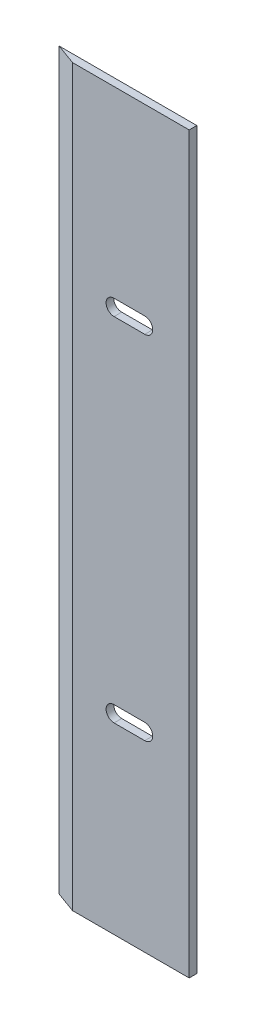
ISO-10303-21;
HEADER;
FILE_DESCRIPTION(('STEP AP214'),'2;1');
FILE_NAME('part.step','',(''),(''),'','','');
FILE_SCHEMA(('AUTOMOTIVE_DESIGN { 1 0 10303 214 1 1 1 1 }'));
ENDSEC;
DATA;
#1=APPLICATION_CONTEXT('core data for automotive mechanical design processes');
#2=APPLICATION_PROTOCOL_DEFINITION('international standard','automotive_design',2000,#1);
#3=PRODUCT_CONTEXT('',#1,'mechanical');
#4=PRODUCT('Part','Part','',(#3));
#5=PRODUCT_RELATED_PRODUCT_CATEGORY('part','',(#4));
#6=PRODUCT_DEFINITION_FORMATION('','',#4);
#7=PRODUCT_DEFINITION_CONTEXT('part definition',#1,'design');
#8=PRODUCT_DEFINITION('design','',#6,#7);
#9=PRODUCT_DEFINITION_SHAPE('','',#8);
#10=(LENGTH_UNIT() NAMED_UNIT(*) SI_UNIT(.MILLI.,.METRE.));
#11=(NAMED_UNIT(*) PLANE_ANGLE_UNIT() SI_UNIT($,.RADIAN.));
#12=(NAMED_UNIT(*) SI_UNIT($,.STERADIAN.) SOLID_ANGLE_UNIT());
#13=UNCERTAINTY_MEASURE_WITH_UNIT(LENGTH_MEASURE(1.E-05),#10,'distance_accuracy_value','');
#14=(GEOMETRIC_REPRESENTATION_CONTEXT(3) GLOBAL_UNCERTAINTY_ASSIGNED_CONTEXT((#13)) GLOBAL_UNIT_ASSIGNED_CONTEXT((#10,
#11,#12)) REPRESENTATION_CONTEXT('',''));
#15=CARTESIAN_POINT('',(0.,0.,0.));
#16=DIRECTION('',(0.,0.,1.));
#17=DIRECTION('',(1.,0.,0.));
#18=AXIS2_PLACEMENT_3D('',#15,#16,#17);
#19=CARTESIAN_POINT('',(0.,-24.0371227709754,1.));
#20=DIRECTION('',(0.,-1.,0.));
#21=DIRECTION('',(0.,0.,-1.));
#22=AXIS2_PLACEMENT_3D('',#19,#20,#21);
#23=PLANE('',#22);
#24=DIRECTION('',(-1.,0.,0.));
#25=VECTOR('',#24,1.);
#26=CARTESIAN_POINT('',(0.,-24.0371227709754,0.));
#27=LINE('',#26,#25);
#28=CARTESIAN_POINT('',(-54.2544310190482,-24.0371227709754,0.));
#29=VERTEX_POINT('',#28);
#30=CARTESIAN_POINT('',(-58.2719722755347,-24.0371227709754,0.));
#31=VERTEX_POINT('',#30);
#32=EDGE_CURVE('E172',#29,#31,#27,.T.);
#33=ORIENTED_EDGE('',*,*,#32,.T.);
#34=DIRECTION('',(0.,0.,-1.));
#35=VECTOR('',#34,1.);
#36=CARTESIAN_POINT('',(-58.2719722755347,-24.0371227709754,1.));
#37=LINE('',#36,#35);
#38=CARTESIAN_POINT('',(-58.2719722755347,-24.0371227709754,1.));
#39=VERTEX_POINT('',#38);
#40=EDGE_CURVE('E11',#39,#31,#37,.T.);
#41=ORIENTED_EDGE('',*,*,#40,.F.);
#42=DIRECTION('',(-1.,0.,0.));
#43=VECTOR('',#42,1.);
#44=CARTESIAN_POINT('',(0.,-24.0371227709754,1.));
#45=LINE('',#44,#43);
#46=CARTESIAN_POINT('',(-54.2544310190482,-24.0371227709754,1.));
#47=VERTEX_POINT('',#46);
#48=EDGE_CURVE('E130',#47,#39,#45,.T.);
#49=ORIENTED_EDGE('',*,*,#48,.F.);
#50=DIRECTION('',(0.,0.,-1.));
#51=VECTOR('',#50,1.);
#52=CARTESIAN_POINT('',(-54.2544310190482,-24.0371227709754,1.));
#53=LINE('',#52,#51);
#54=EDGE_CURVE('E180',#47,#29,#53,.T.);
#55=ORIENTED_EDGE('',*,*,#54,.T.);
#56=EDGE_LOOP('',(#33,#41,#49,#55));
#57=FACE_BOUND('',#56,.T.);
#58=ADVANCED_FACE('F34',(#57),#23,.F.);
#59=CARTESIAN_POINT('',(-58.2719722755347,-22.9999999999996,1.));
#60=DIRECTION('',(0.,0.,-1.));
#61=DIRECTION('',(-1.,0.,0.));
#62=AXIS2_PLACEMENT_3D('',#59,#60,#61);
#63=CYLINDRICAL_SURFACE('',#62,1.03712277097589);
#64=CARTESIAN_POINT('',(-58.2719722755347,-22.9999999999996,0.));
#65=DIRECTION('',(0.,0.,1.));
#66=DIRECTION('',(1.,0.,0.));
#67=AXIS2_PLACEMENT_3D('',#64,#65,#66);
#68=CIRCLE('',#67,1.03712277097589);
#69=CARTESIAN_POINT('',(-58.2719722755347,-21.9628772290237,0.));
#70=VERTEX_POINT('',#69);
#71=EDGE_CURVE('E136',#31,#70,#68,.F.);
#72=ORIENTED_EDGE('',*,*,#71,.T.);
#73=DIRECTION('',(0.,0.,-1.));
#74=VECTOR('',#73,1.);
#75=CARTESIAN_POINT('',(-58.2719722755347,-21.9628772290237,1.));
#76=LINE('',#75,#74);
#77=CARTESIAN_POINT('',(-58.2719722755347,-21.9628772290237,1.));
#78=VERTEX_POINT('',#77);
#79=EDGE_CURVE('E44',#78,#70,#76,.T.);
#80=ORIENTED_EDGE('',*,*,#79,.F.);
#81=CARTESIAN_POINT('',(-58.2719722755347,-22.9999999999996,1.));
#82=DIRECTION('',(0.,0.,1.));
#83=DIRECTION('',(1.,0.,0.));
#84=AXIS2_PLACEMENT_3D('',#81,#82,#83);
#85=CIRCLE('',#84,1.03712277097589);
#86=EDGE_CURVE('E124',#39,#78,#85,.F.);
#87=ORIENTED_EDGE('',*,*,#86,.F.);
#88=ORIENTED_EDGE('',*,*,#40,.T.);
#89=EDGE_LOOP('',(#72,#80,#87,#88));
#90=FACE_BOUND('',#89,.T.);
#91=ADVANCED_FACE('F135',(#90),#63,.F.);
#92=CARTESIAN_POINT('',(0.,-21.9628772290237,1.));
#93=DIRECTION('',(0.,-1.,0.));
#94=DIRECTION('',(0.,0.,-1.));
#95=AXIS2_PLACEMENT_3D('',#92,#93,#94);
#96=PLANE('',#95);
#97=DIRECTION('',(-1.,0.,0.));
#98=VECTOR('',#97,1.);
#99=CARTESIAN_POINT('',(0.,-21.9628772290237,0.));
#100=LINE('',#99,#98);
#101=CARTESIAN_POINT('',(-54.2544310190482,-21.9628772290237,0.));
#102=VERTEX_POINT('',#101);
#103=EDGE_CURVE('E176',#102,#70,#100,.T.);
#104=ORIENTED_EDGE('',*,*,#103,.F.);
#105=DIRECTION('',(0.,0.,-1.));
#106=VECTOR('',#105,1.);
#107=CARTESIAN_POINT('',(-54.2544310190482,-21.9628772290237,1.));
#108=LINE('',#107,#106);
#109=CARTESIAN_POINT('',(-54.2544310190482,-21.9628772290237,1.));
#110=VERTEX_POINT('',#109);
#111=EDGE_CURVE('E91',#110,#102,#108,.T.);
#112=ORIENTED_EDGE('',*,*,#111,.F.);
#113=DIRECTION('',(-1.,0.,0.));
#114=VECTOR('',#113,1.);
#115=CARTESIAN_POINT('',(0.,-21.9628772290237,1.));
#116=LINE('',#115,#114);
#117=EDGE_CURVE('E128',#110,#78,#116,.T.);
#118=ORIENTED_EDGE('',*,*,#117,.T.);
#119=ORIENTED_EDGE('',*,*,#79,.T.);
#120=EDGE_LOOP('',(#104,#112,#118,#119));
#121=FACE_BOUND('',#120,.T.);
#122=ADVANCED_FACE('F141',(#121),#96,.T.);
#123=CARTESIAN_POINT('',(0.,48.,1.));
#124=DIRECTION('',(0.,-1.,0.));
#125=DIRECTION('',(0.,0.,-1.));
#126=AXIS2_PLACEMENT_3D('',#123,#124,#125);
#127=PLANE('',#126);
#128=DIRECTION('',(-1.,0.,0.));
#129=VECTOR('',#128,1.);
#130=CARTESIAN_POINT('',(0.,48.,0.));
#131=LINE('',#130,#129);
#132=CARTESIAN_POINT('',(-48.4463024388675,48.,0.));
#133=VERTEX_POINT('',#132);
#134=CARTESIAN_POINT('',(-66.4463024388675,48.,0.));
#135=VERTEX_POINT('',#134);
#136=EDGE_CURVE('E160',#133,#135,#131,.T.);
#137=ORIENTED_EDGE('',*,*,#136,.T.);
#138=DIRECTION('',(-0.93969262078591,0.,-0.342020143325663));
#139=VECTOR('',#138,1.);
#140=CARTESIAN_POINT('',(-66.4463024388675,48.,0.));
#141=LINE('',#140,#139);
#142=CARTESIAN_POINT('',(-63.6988250194129,48.,1.));
#143=VERTEX_POINT('',#142);
#144=EDGE_CURVE('E245',#143,#135,#141,.T.);
#145=ORIENTED_EDGE('',*,*,#144,.F.);
#146=DIRECTION('',(-1.,0.,0.));
#147=VECTOR('',#146,1.);
#148=CARTESIAN_POINT('',(0.,48.,1.));
#149=LINE('',#148,#147);
#150=CARTESIAN_POINT('',(-48.4463024388675,48.,1.));
#151=VERTEX_POINT('',#150);
#152=EDGE_CURVE('E212',#151,#143,#149,.T.);
#153=ORIENTED_EDGE('',*,*,#152,.F.);
#154=DIRECTION('',(0.,0.,-1.));
#155=VECTOR('',#154,1.);
#156=CARTESIAN_POINT('',(-48.4463024388675,48.,1.));
#157=LINE('',#156,#155);
#158=EDGE_CURVE('E184',#151,#133,#157,.T.);
#159=ORIENTED_EDGE('',*,*,#158,.T.);
#160=EDGE_LOOP('',(#137,#145,#153,#159));
#161=FACE_BOUND('',#160,.T.);
#162=ADVANCED_FACE('F249',(#161),#127,.F.);
#163=CARTESIAN_POINT('',(0.,-48.,1.));
#164=DIRECTION('',(0.,-1.,0.));
#165=DIRECTION('',(0.,0.,-1.));
#166=AXIS2_PLACEMENT_3D('',#163,#164,#165);
#167=PLANE('',#166);
#168=DIRECTION('',(-0.93969262078591,0.,-0.342020143325663));
#169=VECTOR('',#168,1.);
#170=CARTESIAN_POINT('',(-66.4463024388675,-48.,0.));
#171=LINE('',#170,#169);
#172=CARTESIAN_POINT('',(-63.6988250194129,-48.,1.));
#173=VERTEX_POINT('',#172);
#174=CARTESIAN_POINT('',(-66.4463024388675,-48.,0.));
#175=VERTEX_POINT('',#174);
#176=EDGE_CURVE('E240',#173,#175,#171,.T.);
#177=ORIENTED_EDGE('',*,*,#176,.T.);
#178=DIRECTION('',(-1.,0.,0.));
#179=VECTOR('',#178,1.);
#180=CARTESIAN_POINT('',(0.,-48.,0.));
#181=LINE('',#180,#179);
#182=CARTESIAN_POINT('',(-48.4463024388675,-48.,0.));
#183=VERTEX_POINT('',#182);
#184=EDGE_CURVE('E166',#183,#175,#181,.T.);
#185=ORIENTED_EDGE('',*,*,#184,.F.);
#186=DIRECTION('',(0.,0.,-1.));
#187=VECTOR('',#186,1.);
#188=CARTESIAN_POINT('',(-48.4463024388675,-48.,1.));
#189=LINE('',#188,#187);
#190=CARTESIAN_POINT('',(-48.4463024388675,-48.,1.));
#191=VERTEX_POINT('',#190);
#192=EDGE_CURVE('E182',#191,#183,#189,.T.);
#193=ORIENTED_EDGE('',*,*,#192,.F.);
#194=DIRECTION('',(-1.,0.,0.));
#195=VECTOR('',#194,1.);
#196=CARTESIAN_POINT('',(0.,-48.,1.));
#197=LINE('',#196,#195);
#198=EDGE_CURVE('E220',#191,#173,#197,.T.);
#199=ORIENTED_EDGE('',*,*,#198,.T.);
#200=EDGE_LOOP('',(#177,#185,#193,#199));
#201=FACE_BOUND('',#200,.T.);
#202=ADVANCED_FACE('F238',(#201),#167,.T.);
#203=CARTESIAN_POINT('',(-58.2719722755347,22.9999999999996,1.));
#204=DIRECTION('',(0.,0.,-1.));
#205=DIRECTION('',(-1.,0.,0.));
#206=AXIS2_PLACEMENT_3D('',#203,#204,#205);
#207=CYLINDRICAL_SURFACE('',#206,1.03712277097589);
#208=CARTESIAN_POINT('',(-58.2719722755347,22.9999999999996,0.));
#209=DIRECTION('',(0.,0.,1.));
#210=DIRECTION('',(1.,0.,0.));
#211=AXIS2_PLACEMENT_3D('',#208,#209,#210);
#212=CIRCLE('',#211,1.03712277097589);
#213=CARTESIAN_POINT('',(-58.2719722755347,24.0371227709754,0.));
#214=VERTEX_POINT('',#213);
#215=CARTESIAN_POINT('',(-58.2719722755347,21.9628772290237,0.));
#216=VERTEX_POINT('',#215);
#217=EDGE_CURVE('E147',#214,#216,#212,.T.);
#218=ORIENTED_EDGE('',*,*,#217,.F.);
#219=DIRECTION('',(0.,0.,-1.));
#220=VECTOR('',#219,1.);
#221=CARTESIAN_POINT('',(-58.2719722755347,24.0371227709754,1.));
#222=LINE('',#221,#220);
#223=CARTESIAN_POINT('',(-58.2719722755347,24.0371227709754,1.));
#224=VERTEX_POINT('',#223);
#225=EDGE_CURVE('E38',#224,#214,#222,.T.);
#226=ORIENTED_EDGE('',*,*,#225,.F.);
#227=CARTESIAN_POINT('',(-58.2719722755347,22.9999999999996,1.));
#228=DIRECTION('',(0.,0.,1.));
#229=DIRECTION('',(1.,0.,0.));
#230=AXIS2_PLACEMENT_3D('',#227,#228,#229);
#231=CIRCLE('',#230,1.03712277097589);
#232=CARTESIAN_POINT('',(-58.2719722755347,21.9628772290237,1.));
#233=VERTEX_POINT('',#232);
#234=EDGE_CURVE('E179',#224,#233,#231,.T.);
#235=ORIENTED_EDGE('',*,*,#234,.T.);
#236=DIRECTION('',(0.,0.,-1.));
#237=VECTOR('',#236,1.);
#238=CARTESIAN_POINT('',(-58.2719722755347,21.9628772290237,1.));
#239=LINE('',#238,#237);
#240=EDGE_CURVE('E143',#233,#216,#239,.T.);
#241=ORIENTED_EDGE('',*,*,#240,.T.);
#242=EDGE_LOOP('',(#218,#226,#235,#241));
#243=FACE_BOUND('',#242,.T.);
#244=ADVANCED_FACE('F36',(#243),#207,.F.);
#245=CARTESIAN_POINT('',(0.,24.0371227709754,1.));
#246=DIRECTION('',(0.,-1.,0.));
#247=DIRECTION('',(0.,0.,-1.));
#248=AXIS2_PLACEMENT_3D('',#245,#246,#247);
#249=PLANE('',#248);
#250=DIRECTION('',(-1.,0.,0.));
#251=VECTOR('',#250,1.);
#252=CARTESIAN_POINT('',(0.,24.0371227709754,0.));
#253=LINE('',#252,#251);
#254=CARTESIAN_POINT('',(-54.2544310190482,24.0371227709754,0.));
#255=VERTEX_POINT('',#254);
#256=EDGE_CURVE('E150',#255,#214,#253,.T.);
#257=ORIENTED_EDGE('',*,*,#256,.F.);
#258=DIRECTION('',(0.,0.,-1.));
#259=VECTOR('',#258,1.);
#260=CARTESIAN_POINT('',(-54.2544310190482,24.0371227709754,1.));
#261=LINE('',#260,#259);
#262=CARTESIAN_POINT('',(-54.2544310190482,24.0371227709754,1.));
#263=VERTEX_POINT('',#262);
#264=EDGE_CURVE('E189',#263,#255,#261,.T.);
#265=ORIENTED_EDGE('',*,*,#264,.F.);
#266=DIRECTION('',(-1.,0.,0.));
#267=VECTOR('',#266,1.);
#268=CARTESIAN_POINT('',(0.,24.0371227709754,1.));
#269=LINE('',#268,#267);
#270=EDGE_CURVE('E198',#263,#224,#269,.T.);
#271=ORIENTED_EDGE('',*,*,#270,.T.);
#272=ORIENTED_EDGE('',*,*,#225,.T.);
#273=EDGE_LOOP('',(#257,#265,#271,#272));
#274=FACE_BOUND('',#273,.T.);
#275=ADVANCED_FACE('F196',(#274),#249,.T.);
#276=CARTESIAN_POINT('',(-54.2544310190482,22.9999999999996,1.));
#277=DIRECTION('',(0.,0.,-1.));
#278=DIRECTION('',(-1.,0.,0.));
#279=AXIS2_PLACEMENT_3D('',#276,#277,#278);
#280=CYLINDRICAL_SURFACE('',#279,1.03712277097589);
#281=CARTESIAN_POINT('',(-54.2544310190482,22.9999999999996,0.));
#282=DIRECTION('',(0.,0.,1.));
#283=DIRECTION('',(1.,0.,0.));
#284=AXIS2_PLACEMENT_3D('',#281,#282,#283);
#285=CIRCLE('',#284,1.03712277097589);
#286=CARTESIAN_POINT('',(-54.2544310190482,21.9628772290237,0.));
#287=VERTEX_POINT('',#286);
#288=EDGE_CURVE('E154',#287,#255,#285,.T.);
#289=ORIENTED_EDGE('',*,*,#288,.F.);
#290=DIRECTION('',(0.,0.,-1.));
#291=VECTOR('',#290,1.);
#292=CARTESIAN_POINT('',(-54.2544310190482,21.9628772290237,1.));
#293=LINE('',#292,#291);
#294=CARTESIAN_POINT('',(-54.2544310190482,21.9628772290237,1.));
#295=VERTEX_POINT('',#294);
#296=EDGE_CURVE('E188',#295,#287,#293,.T.);
#297=ORIENTED_EDGE('',*,*,#296,.F.);
#298=CARTESIAN_POINT('',(-54.2544310190482,22.9999999999996,1.));
#299=DIRECTION('',(0.,0.,1.));
#300=DIRECTION('',(1.,0.,0.));
#301=AXIS2_PLACEMENT_3D('',#298,#299,#300);
#302=CIRCLE('',#301,1.03712277097589);
#303=EDGE_CURVE('E207',#295,#263,#302,.T.);
#304=ORIENTED_EDGE('',*,*,#303,.T.);
#305=ORIENTED_EDGE('',*,*,#264,.T.);
#306=EDGE_LOOP('',(#289,#297,#304,#305));
#307=FACE_BOUND('',#306,.T.);
#308=ADVANCED_FACE('F204',(#307),#280,.F.);
#309=CARTESIAN_POINT('',(-48.4463024388675,0.,1.));
#310=DIRECTION('',(1.,0.,0.));
#311=DIRECTION('',(0.,0.,-1.));
#312=AXIS2_PLACEMENT_3D('',#309,#310,#311);
#313=PLANE('',#312);
#314=DIRECTION('',(0.,-1.,0.));
#315=VECTOR('',#314,1.);
#316=CARTESIAN_POINT('',(-48.4463024388675,0.,0.));
#317=LINE('',#316,#315);
#318=EDGE_CURVE('E169',#133,#183,#317,.T.);
#319=ORIENTED_EDGE('',*,*,#318,.F.);
#320=ORIENTED_EDGE('',*,*,#158,.F.);
#321=DIRECTION('',(0.,-1.,0.));
#322=VECTOR('',#321,1.);
#323=CARTESIAN_POINT('',(-48.4463024388675,0.,1.));
#324=LINE('',#323,#322);
#325=EDGE_CURVE('E223',#151,#191,#324,.T.);
#326=ORIENTED_EDGE('',*,*,#325,.T.);
#327=ORIENTED_EDGE('',*,*,#192,.T.);
#328=EDGE_LOOP('',(#319,#320,#326,#327));
#329=FACE_BOUND('',#328,.T.);
#330=ADVANCED_FACE('F228',(#329),#313,.T.);
#331=CARTESIAN_POINT('',(0.,21.9628772290237,1.));
#332=DIRECTION('',(0.,-1.,0.));
#333=DIRECTION('',(0.,0.,-1.));
#334=AXIS2_PLACEMENT_3D('',#331,#332,#333);
#335=PLANE('',#334);
#336=DIRECTION('',(-1.,0.,0.));
#337=VECTOR('',#336,1.);
#338=CARTESIAN_POINT('',(0.,21.9628772290237,0.));
#339=LINE('',#338,#337);
#340=EDGE_CURVE('E157',#287,#216,#339,.T.);
#341=ORIENTED_EDGE('',*,*,#340,.T.);
#342=ORIENTED_EDGE('',*,*,#240,.F.);
#343=DIRECTION('',(-1.,0.,0.));
#344=VECTOR('',#343,1.);
#345=CARTESIAN_POINT('',(0.,21.9628772290237,1.));
#346=LINE('',#345,#344);
#347=EDGE_CURVE('E209',#295,#233,#346,.T.);
#348=ORIENTED_EDGE('',*,*,#347,.F.);
#349=ORIENTED_EDGE('',*,*,#296,.T.);
#350=EDGE_LOOP('',(#341,#342,#348,#349));
#351=FACE_BOUND('',#350,.T.);
#352=ADVANCED_FACE('F210',(#351),#335,.F.);
#353=CARTESIAN_POINT('',(-54.2544310190482,-22.9999999999996,1.));
#354=DIRECTION('',(0.,0.,-1.));
#355=DIRECTION('',(-1.,0.,0.));
#356=AXIS2_PLACEMENT_3D('',#353,#354,#355);
#357=CYLINDRICAL_SURFACE('',#356,1.03712277097589);
#358=CARTESIAN_POINT('',(-54.2544310190482,-22.9999999999996,0.));
#359=DIRECTION('',(0.,0.,1.));
#360=DIRECTION('',(1.,0.,0.));
#361=AXIS2_PLACEMENT_3D('',#358,#359,#360);
#362=CIRCLE('',#361,1.03712277097589);
#363=EDGE_CURVE('E94',#102,#29,#362,.F.);
#364=ORIENTED_EDGE('',*,*,#363,.T.);
#365=ORIENTED_EDGE('',*,*,#54,.F.);
#366=CARTESIAN_POINT('',(-54.2544310190482,-22.9999999999996,1.));
#367=DIRECTION('',(0.,0.,1.));
#368=DIRECTION('',(1.,0.,0.));
#369=AXIS2_PLACEMENT_3D('',#366,#367,#368);
#370=CIRCLE('',#369,1.03712277097589);
#371=EDGE_CURVE('E53',#110,#47,#370,.F.);
#372=ORIENTED_EDGE('',*,*,#371,.F.);
#373=ORIENTED_EDGE('',*,*,#111,.T.);
#374=EDGE_LOOP('',(#364,#365,#372,#373));
#375=FACE_BOUND('',#374,.T.);
#376=ADVANCED_FACE('F258',(#375),#357,.F.);
#377=CARTESIAN_POINT('',(0.,0.,1.));
#378=DIRECTION('',(0.,0.,1.));
#379=DIRECTION('',(1.,0.,0.));
#380=AXIS2_PLACEMENT_3D('',#377,#378,#379);
#381=PLANE('',#380);
#382=DIRECTION('',(0.,1.,0.));
#383=VECTOR('',#382,1.);
#384=CARTESIAN_POINT('',(-63.6988250194129,-48.,1.));
#385=LINE('',#384,#383);
#386=EDGE_CURVE('E151',#173,#143,#385,.T.);
#387=ORIENTED_EDGE('',*,*,#386,.F.);
#388=ORIENTED_EDGE('',*,*,#198,.F.);
#389=ORIENTED_EDGE('',*,*,#325,.F.);
#390=ORIENTED_EDGE('',*,*,#152,.T.);
#391=EDGE_LOOP('',(#387,#388,#389,#390));
#392=FACE_BOUND('',#391,.T.);
#393=ORIENTED_EDGE('',*,*,#234,.F.);
#394=ORIENTED_EDGE('',*,*,#270,.F.);
#395=ORIENTED_EDGE('',*,*,#303,.F.);
#396=ORIENTED_EDGE('',*,*,#347,.T.);
#397=EDGE_LOOP('',(#393,#394,#395,#396));
#398=FACE_BOUND('',#397,.T.);
#399=ORIENTED_EDGE('',*,*,#48,.T.);
#400=ORIENTED_EDGE('',*,*,#86,.T.);
#401=ORIENTED_EDGE('',*,*,#117,.F.);
#402=ORIENTED_EDGE('',*,*,#371,.T.);
#403=EDGE_LOOP('',(#399,#400,#401,#402));
#404=FACE_BOUND('',#403,.T.);
#405=ADVANCED_FACE('F126',(#392,#398,#404),#381,.T.);
#406=CARTESIAN_POINT('',(0.,0.,0.));
#407=DIRECTION('',(0.,0.,1.));
#408=DIRECTION('',(1.,0.,0.));
#409=AXIS2_PLACEMENT_3D('',#406,#407,#408);
#410=PLANE('',#409);
#411=ORIENTED_EDGE('',*,*,#217,.T.);
#412=ORIENTED_EDGE('',*,*,#340,.F.);
#413=ORIENTED_EDGE('',*,*,#288,.T.);
#414=ORIENTED_EDGE('',*,*,#256,.T.);
#415=EDGE_LOOP('',(#411,#412,#413,#414));
#416=FACE_BOUND('',#415,.T.);
#417=ORIENTED_EDGE('',*,*,#136,.F.);
#418=ORIENTED_EDGE('',*,*,#318,.T.);
#419=ORIENTED_EDGE('',*,*,#184,.T.);
#420=DIRECTION('',(0.,-1.,0.));
#421=VECTOR('',#420,1.);
#422=CARTESIAN_POINT('',(-66.4463024388675,0.,0.));
#423=LINE('',#422,#421);
#424=EDGE_CURVE('E163',#135,#175,#423,.T.);
#425=ORIENTED_EDGE('',*,*,#424,.F.);
#426=EDGE_LOOP('',(#417,#418,#419,#425));
#427=FACE_BOUND('',#426,.T.);
#428=ORIENTED_EDGE('',*,*,#32,.F.);
#429=ORIENTED_EDGE('',*,*,#363,.F.);
#430=ORIENTED_EDGE('',*,*,#103,.T.);
#431=ORIENTED_EDGE('',*,*,#71,.F.);
#432=EDGE_LOOP('',(#428,#429,#430,#431));
#433=FACE_BOUND('',#432,.T.);
#434=ADVANCED_FACE('F202',(#416,#427,#433),#410,.F.);
#435=CARTESIAN_POINT('',(-66.4463024388675,-48.,0.));
#436=DIRECTION('',(0.342020143325663,0.,-0.93969262078591));
#437=DIRECTION('',(-0.939692620785911,0.,-0.342020143325663));
#438=AXIS2_PLACEMENT_3D('',#435,#436,#437);
#439=PLANE('',#438);
#440=ORIENTED_EDGE('',*,*,#144,.T.);
#441=ORIENTED_EDGE('',*,*,#424,.T.);
#442=ORIENTED_EDGE('',*,*,#176,.F.);
#443=ORIENTED_EDGE('',*,*,#386,.T.);
#444=EDGE_LOOP('',(#440,#441,#442,#443));
#445=FACE_BOUND('',#444,.T.);
#446=ADVANCED_FACE('F244',(#445),#439,.F.);
#447=CLOSED_SHELL('',(#58,#91,#122,#162,#202,#244,#275,#308,#330,#352,#376,#405,#434,#446));
#448=MANIFOLD_SOLID_BREP('B2',#447);
#449=ADVANCED_BREP_SHAPE_REPRESENTATION('',(#18,#448),#14);
#450=SHAPE_DEFINITION_REPRESENTATION(#9,#449);
ENDSEC;
END-ISO-10303-21;
